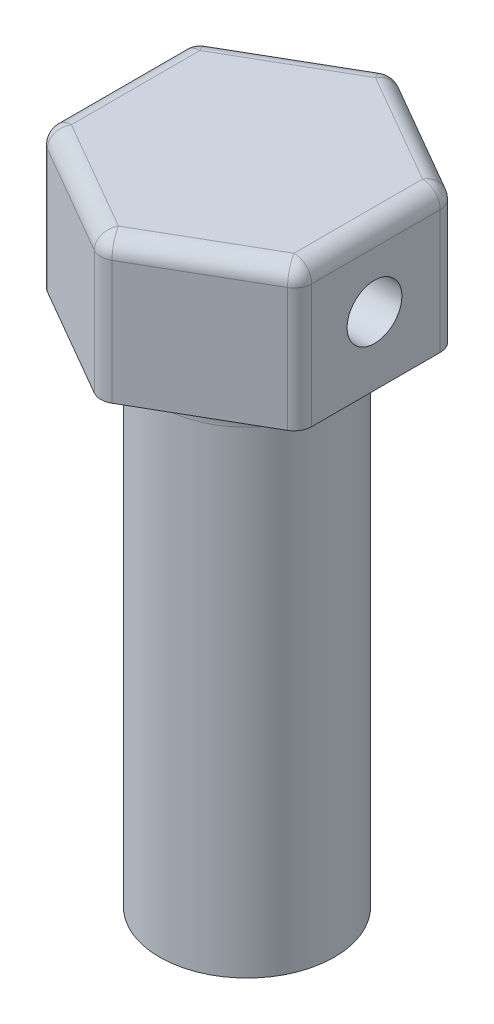
ISO-10303-21;
HEADER;
FILE_DESCRIPTION(('STEP AP214'),'2;1');
FILE_NAME('part.step','',(''),(''),'','','');
FILE_SCHEMA(('AUTOMOTIVE_DESIGN { 1 0 10303 214 1 1 1 1 }'));
ENDSEC;
DATA;
#1=APPLICATION_CONTEXT('core data for automotive mechanical design processes');
#2=APPLICATION_PROTOCOL_DEFINITION('international standard','automotive_design',2000,#1);
#3=PRODUCT_CONTEXT('',#1,'mechanical');
#4=PRODUCT('Part','Part','',(#3));
#5=PRODUCT_RELATED_PRODUCT_CATEGORY('part','',(#4));
#6=PRODUCT_DEFINITION_FORMATION('','',#4);
#7=PRODUCT_DEFINITION_CONTEXT('part definition',#1,'design');
#8=PRODUCT_DEFINITION('design','',#6,#7);
#9=PRODUCT_DEFINITION_SHAPE('','',#8);
#10=(LENGTH_UNIT() NAMED_UNIT(*) SI_UNIT(.MILLI.,.METRE.));
#11=(NAMED_UNIT(*) PLANE_ANGLE_UNIT() SI_UNIT($,.RADIAN.));
#12=(NAMED_UNIT(*) SI_UNIT($,.STERADIAN.) SOLID_ANGLE_UNIT());
#13=UNCERTAINTY_MEASURE_WITH_UNIT(LENGTH_MEASURE(1.E-05),#10,'distance_accuracy_value','');
#14=(GEOMETRIC_REPRESENTATION_CONTEXT(3) GLOBAL_UNCERTAINTY_ASSIGNED_CONTEXT((#13)) GLOBAL_UNIT_ASSIGNED_CONTEXT((#10,
#11,#12)) REPRESENTATION_CONTEXT('',''));
#15=CARTESIAN_POINT('',(0.,0.,0.));
#16=DIRECTION('',(0.,0.,1.));
#17=DIRECTION('',(1.,0.,0.));
#18=AXIS2_PLACEMENT_3D('',#15,#16,#17);
#19=CARTESIAN_POINT('',(-1.5,-29.,1.45177692845699));
#20=DIRECTION('',(1.,0.,0.));
#21=DIRECTION('',(0.,0.,-1.));
#22=AXIS2_PLACEMENT_3D('',#19,#20,#21);
#23=PLANE('',#22);
#24=DIRECTION('',(0.,1.,0.));
#25=VECTOR('',#24,1.);
#26=CARTESIAN_POINT('',(-1.5,-29.,1.45177692845699));
#27=LINE('',#26,#25);
#28=CARTESIAN_POINT('',(-1.5,-27.,1.45177692845699));
#29=VERTEX_POINT('',#28);
#30=CARTESIAN_POINT('',(-1.5,0.,1.45177692845699));
#31=VERTEX_POINT('',#30);
#32=EDGE_CURVE('E167',#29,#31,#27,.T.);
#33=ORIENTED_EDGE('',*,*,#32,.F.);
#34=DIRECTION('',(0.,0.,-1.));
#35=VECTOR('',#34,1.);
#36=CARTESIAN_POINT('',(-1.5,-27.,1.45177692845699));
#37=LINE('',#36,#35);
#38=CARTESIAN_POINT('',(-1.5,-27.,-1.45177692845699));
#39=VERTEX_POINT('',#38);
#40=EDGE_CURVE('E12',#29,#39,#37,.T.);
#41=ORIENTED_EDGE('',*,*,#40,.T.);
#42=DIRECTION('',(0.,1.,0.));
#43=VECTOR('',#42,1.);
#44=CARTESIAN_POINT('',(-1.5,-29.,-1.45177692845699));
#45=LINE('',#44,#43);
#46=CARTESIAN_POINT('',(-1.5,0.,-1.45177692845699));
#47=VERTEX_POINT('',#46);
#48=EDGE_CURVE('E169',#39,#47,#45,.T.);
#49=ORIENTED_EDGE('',*,*,#48,.T.);
#50=DIRECTION('',(0.,0.,-1.));
#51=VECTOR('',#50,1.);
#52=CARTESIAN_POINT('',(-1.5,0.,1.45177692845699));
#53=LINE('',#52,#51);
#54=EDGE_CURVE('E173',#31,#47,#53,.T.);
#55=ORIENTED_EDGE('',*,*,#54,.F.);
#56=EDGE_LOOP('',(#33,#41,#49,#55));
#57=FACE_BOUND('',#56,.T.);
#58=ADVANCED_FACE('F43',(#57),#23,.T.);
#59=CARTESIAN_POINT('',(0.,0.,0.));
#60=DIRECTION('',(0.,1.,0.));
#61=DIRECTION('',(0.,0.,1.));
#62=AXIS2_PLACEMENT_3D('',#59,#60,#61);
#63=PLANE('',#62);
#64=CARTESIAN_POINT('',(0.,0.,0.));
#65=DIRECTION('',(0.,1.,0.));
#66=DIRECTION('',(0.,0.,1.));
#67=AXIS2_PLACEMENT_3D('',#64,#65,#66);
#68=CIRCLE('',#67,6.95);
#69=CARTESIAN_POINT('',(0.,0.,6.95));
#70=VERTEX_POINT('',#69);
#71=EDGE_CURVE('E203',#70,#70,#68,.T.);
#72=ORIENTED_EDGE('',*,*,#71,.T.);
#73=EDGE_LOOP('',(#72));
#74=FACE_BOUND('',#73,.T.);
#75=DIRECTION('',(0.,0.,1.));
#76=VECTOR('',#75,1.);
#77=CARTESIAN_POINT('',(-7.3,0.,-4.21465696508427));
#78=LINE('',#77,#76);
#79=CARTESIAN_POINT('',(-7.3,0.,-3.63730669589464));
#80=VERTEX_POINT('',#79);
#81=CARTESIAN_POINT('',(-7.3,0.,3.63730669589464));
#82=VERTEX_POINT('',#81);
#83=EDGE_CURVE('E194',#80,#82,#78,.T.);
#84=ORIENTED_EDGE('',*,*,#83,.F.);
#85=CARTESIAN_POINT('',(-6.3,0.,-3.63730669589464));
#86=DIRECTION('',(0.,1.,0.));
#87=DIRECTION('',(0.,0.,1.));
#88=AXIS2_PLACEMENT_3D('',#85,#86,#87);
#89=CIRCLE('',#88,1.);
#90=CARTESIAN_POINT('',(-6.8,0.,-4.50333209967908));
#91=VERTEX_POINT('',#90);
#92=EDGE_CURVE('E51',#80,#91,#89,.F.);
#93=ORIENTED_EDGE('',*,*,#92,.T.);
#94=DIRECTION('',(-0.866025403784439,0.,0.5));
#95=VECTOR('',#94,1.);
#96=CARTESIAN_POINT('',(0.,0.,-8.42931393016854));
#97=LINE('',#96,#95);
#98=CARTESIAN_POINT('',(-0.5,0.,-8.14063879557373));
#99=VERTEX_POINT('',#98);
#100=EDGE_CURVE('E191',#99,#91,#97,.T.);
#101=ORIENTED_EDGE('',*,*,#100,.F.);
#102=CARTESIAN_POINT('',(0.,0.,-7.27461339178929));
#103=DIRECTION('',(0.,1.,0.));
#104=DIRECTION('',(0.,0.,1.));
#105=AXIS2_PLACEMENT_3D('',#102,#103,#104);
#106=CIRCLE('',#105,1.);
#107=CARTESIAN_POINT('',(0.5,0.,-8.14063879557372));
#108=VERTEX_POINT('',#107);
#109=EDGE_CURVE('E263',#99,#108,#106,.F.);
#110=ORIENTED_EDGE('',*,*,#109,.T.);
#111=DIRECTION('',(-0.866025403784439,0.,-0.5));
#112=VECTOR('',#111,1.);
#113=CARTESIAN_POINT('',(7.3,0.,-4.21465696508427));
#114=LINE('',#113,#112);
#115=CARTESIAN_POINT('',(6.8,0.,-4.50333209967908));
#116=VERTEX_POINT('',#115);
#117=EDGE_CURVE('E188',#116,#108,#114,.T.);
#118=ORIENTED_EDGE('',*,*,#117,.F.);
#119=CARTESIAN_POINT('',(6.3,0.,-3.63730669589465));
#120=DIRECTION('',(0.,1.,0.));
#121=DIRECTION('',(0.,0.,1.));
#122=AXIS2_PLACEMENT_3D('',#119,#120,#121);
#123=CIRCLE('',#122,1.);
#124=CARTESIAN_POINT('',(7.3,0.,-3.63730669589465));
#125=VERTEX_POINT('',#124);
#126=EDGE_CURVE('E261',#116,#125,#123,.F.);
#127=ORIENTED_EDGE('',*,*,#126,.T.);
#128=DIRECTION('',(0.,0.,-1.));
#129=VECTOR('',#128,1.);
#130=CARTESIAN_POINT('',(7.3,0.,4.21465696508427));
#131=LINE('',#130,#129);
#132=CARTESIAN_POINT('',(7.3,0.,3.63730669589464));
#133=VERTEX_POINT('',#132);
#134=EDGE_CURVE('E185',#133,#125,#131,.T.);
#135=ORIENTED_EDGE('',*,*,#134,.F.);
#136=CARTESIAN_POINT('',(6.3,0.,3.63730669589464));
#137=DIRECTION('',(0.,1.,0.));
#138=DIRECTION('',(0.,0.,1.));
#139=AXIS2_PLACEMENT_3D('',#136,#137,#138);
#140=CIRCLE('',#139,1.);
#141=CARTESIAN_POINT('',(6.8,0.,4.50333209967908));
#142=VERTEX_POINT('',#141);
#143=EDGE_CURVE('E259',#133,#142,#140,.F.);
#144=ORIENTED_EDGE('',*,*,#143,.T.);
#145=DIRECTION('',(0.866025403784439,0.,-0.5));
#146=VECTOR('',#145,1.);
#147=CARTESIAN_POINT('',(0.,0.,8.42931393016854));
#148=LINE('',#147,#146);
#149=CARTESIAN_POINT('',(0.500000000000001,0.,8.14063879557373));
#150=VERTEX_POINT('',#149);
#151=EDGE_CURVE('E178',#150,#142,#148,.T.);
#152=ORIENTED_EDGE('',*,*,#151,.F.);
#153=CARTESIAN_POINT('',(0.,0.,7.27461339178929));
#154=DIRECTION('',(0.,1.,0.));
#155=DIRECTION('',(0.,0.,1.));
#156=AXIS2_PLACEMENT_3D('',#153,#154,#155);
#157=CIRCLE('',#156,1.);
#158=CARTESIAN_POINT('',(-0.5,0.,8.14063879557373));
#159=VERTEX_POINT('',#158);
#160=EDGE_CURVE('E257',#150,#159,#157,.F.);
#161=ORIENTED_EDGE('',*,*,#160,.T.);
#162=DIRECTION('',(0.866025403784438,0.,0.5));
#163=VECTOR('',#162,1.);
#164=CARTESIAN_POINT('',(-7.3,0.,4.21465696508427));
#165=LINE('',#164,#163);
#166=CARTESIAN_POINT('',(-6.8,0.,4.50333209967908));
#167=VERTEX_POINT('',#166);
#168=EDGE_CURVE('E197',#167,#159,#165,.T.);
#169=ORIENTED_EDGE('',*,*,#168,.F.);
#170=CARTESIAN_POINT('',(-6.3,0.,3.63730669589464));
#171=DIRECTION('',(0.,1.,0.));
#172=DIRECTION('',(0.,0.,1.));
#173=AXIS2_PLACEMENT_3D('',#170,#171,#172);
#174=CIRCLE('',#173,1.);
#175=EDGE_CURVE('E255',#167,#82,#174,.F.);
#176=ORIENTED_EDGE('',*,*,#175,.T.);
#177=EDGE_LOOP('',(#84,#93,#101,#110,#118,#127,#135,#144,#152,#161,#169,#176));
#178=FACE_BOUND('',#177,.T.);
#179=ADVANCED_FACE('F335',(#74,#178),#63,.F.);
#180=CARTESIAN_POINT('',(0.,8.,8.42931393016854));
#181=DIRECTION('',(-0.5,0.,-0.866025403784439));
#182=DIRECTION('',(-0.866025403784439,0.,0.5));
#183=AXIS2_PLACEMENT_3D('',#180,#181,#182);
#184=PLANE('',#183);
#185=ORIENTED_EDGE('',*,*,#151,.T.);
#186=DIRECTION('',(0.,-1.,0.));
#187=VECTOR('',#186,1.);
#188=CARTESIAN_POINT('',(6.8,8.,4.50333209967908));
#189=LINE('',#188,#187);
#190=CARTESIAN_POINT('',(6.8,7.,4.50333209967908));
#191=VERTEX_POINT('',#190);
#192=EDGE_CURVE('E64',#142,#191,#189,.F.);
#193=ORIENTED_EDGE('',*,*,#192,.T.);
#194=DIRECTION('',(0.866025403784439,0.,-0.5));
#195=VECTOR('',#194,1.);
#196=CARTESIAN_POINT('',(0.,7.,8.42931393016854));
#197=LINE('',#196,#195);
#198=CARTESIAN_POINT('',(0.5,7.,8.14063879557373));
#199=VERTEX_POINT('',#198);
#200=EDGE_CURVE('E252',#191,#199,#197,.F.);
#201=ORIENTED_EDGE('',*,*,#200,.T.);
#202=DIRECTION('',(0.,-1.,0.));
#203=VECTOR('',#202,1.);
#204=CARTESIAN_POINT('',(0.5,8.,8.14063879557373));
#205=LINE('',#204,#203);
#206=EDGE_CURVE('E250',#199,#150,#205,.T.);
#207=ORIENTED_EDGE('',*,*,#206,.T.);
#208=EDGE_LOOP('',(#185,#193,#201,#207));
#209=FACE_BOUND('',#208,.T.);
#210=ADVANCED_FACE('F348',(#209),#184,.F.);
#211=CARTESIAN_POINT('',(7.3,8.,4.21465696508427));
#212=DIRECTION('',(-1.,0.,0.));
#213=DIRECTION('',(0.,0.,1.));
#214=AXIS2_PLACEMENT_3D('',#211,#212,#213);
#215=PLANE('',#214);
#216=CARTESIAN_POINT('',(7.3,3.85,0.0853430349157284));
#217=DIRECTION('',(1.,0.,0.));
#218=DIRECTION('',(0.,0.,-1.));
#219=AXIS2_PLACEMENT_3D('',#216,#217,#218);
#220=CIRCLE('',#219,1.55);
#221=CARTESIAN_POINT('',(7.3,3.85,-1.46465696508427));
#222=VERTEX_POINT('',#221);
#223=EDGE_CURVE('E315',#222,#222,#220,.T.);
#224=ORIENTED_EDGE('',*,*,#223,.F.);
#225=EDGE_LOOP('',(#224));
#226=FACE_BOUND('',#225,.T.);
#227=ORIENTED_EDGE('',*,*,#134,.T.);
#228=DIRECTION('',(0.,-1.,0.));
#229=VECTOR('',#228,1.);
#230=CARTESIAN_POINT('',(7.3,8.,-3.63730669589465));
#231=LINE('',#230,#229);
#232=CARTESIAN_POINT('',(7.3,7.,-3.63730669589465));
#233=VERTEX_POINT('',#232);
#234=EDGE_CURVE('E248',#125,#233,#231,.F.);
#235=ORIENTED_EDGE('',*,*,#234,.T.);
#236=DIRECTION('',(0.,0.,-1.));
#237=VECTOR('',#236,1.);
#238=CARTESIAN_POINT('',(7.3,7.,4.21465696508427));
#239=LINE('',#238,#237);
#240=CARTESIAN_POINT('',(7.3,7.,3.63730669589464));
#241=VERTEX_POINT('',#240);
#242=EDGE_CURVE('E246',#233,#241,#239,.F.);
#243=ORIENTED_EDGE('',*,*,#242,.T.);
#244=DIRECTION('',(0.,-1.,0.));
#245=VECTOR('',#244,1.);
#246=CARTESIAN_POINT('',(7.3,8.,3.63730669589464));
#247=LINE('',#246,#245);
#248=EDGE_CURVE('E244',#241,#133,#247,.T.);
#249=ORIENTED_EDGE('',*,*,#248,.T.);
#250=EDGE_LOOP('',(#227,#235,#243,#249));
#251=FACE_BOUND('',#250,.T.);
#252=ADVANCED_FACE('F413',(#226,#251),#215,.F.);
#253=CARTESIAN_POINT('',(7.3,8.,-4.21465696508427));
#254=DIRECTION('',(-0.5,0.,0.866025403784439));
#255=DIRECTION('',(0.866025403784439,0.,0.5));
#256=AXIS2_PLACEMENT_3D('',#253,#254,#255);
#257=PLANE('',#256);
#258=ORIENTED_EDGE('',*,*,#117,.T.);
#259=DIRECTION('',(0.,-1.,0.));
#260=VECTOR('',#259,1.);
#261=CARTESIAN_POINT('',(0.5,8.,-8.14063879557372));
#262=LINE('',#261,#260);
#263=CARTESIAN_POINT('',(0.499999999999999,7.,-8.14063879557372));
#264=VERTEX_POINT('',#263);
#265=EDGE_CURVE('E242',#108,#264,#262,.F.);
#266=ORIENTED_EDGE('',*,*,#265,.T.);
#267=DIRECTION('',(-0.866025403784439,0.,-0.5));
#268=VECTOR('',#267,1.);
#269=CARTESIAN_POINT('',(7.3,7.,-4.21465696508427));
#270=LINE('',#269,#268);
#271=CARTESIAN_POINT('',(6.8,7.,-4.50333209967908));
#272=VERTEX_POINT('',#271);
#273=EDGE_CURVE('E240',#264,#272,#270,.F.);
#274=ORIENTED_EDGE('',*,*,#273,.T.);
#275=DIRECTION('',(0.,-1.,0.));
#276=VECTOR('',#275,1.);
#277=CARTESIAN_POINT('',(6.8,8.,-4.50333209967908));
#278=LINE('',#277,#276);
#279=EDGE_CURVE('E238',#272,#116,#278,.T.);
#280=ORIENTED_EDGE('',*,*,#279,.T.);
#281=EDGE_LOOP('',(#258,#266,#274,#280));
#282=FACE_BOUND('',#281,.T.);
#283=ADVANCED_FACE('F461',(#282),#257,.F.);
#284=CARTESIAN_POINT('',(0.,8.,-8.42931393016854));
#285=DIRECTION('',(0.5,0.,0.866025403784439));
#286=DIRECTION('',(0.866025403784439,0.,-0.5));
#287=AXIS2_PLACEMENT_3D('',#284,#285,#286);
#288=PLANE('',#287);
#289=ORIENTED_EDGE('',*,*,#100,.T.);
#290=DIRECTION('',(0.,-1.,0.));
#291=VECTOR('',#290,1.);
#292=CARTESIAN_POINT('',(-6.8,8.,-4.50333209967908));
#293=LINE('',#292,#291);
#294=CARTESIAN_POINT('',(-6.8,7.,-4.50333209967908));
#295=VERTEX_POINT('',#294);
#296=EDGE_CURVE('E236',#91,#295,#293,.F.);
#297=ORIENTED_EDGE('',*,*,#296,.T.);
#298=DIRECTION('',(-0.866025403784439,0.,0.5));
#299=VECTOR('',#298,1.);
#300=CARTESIAN_POINT('',(0.,7.,-8.42931393016854));
#301=LINE('',#300,#299);
#302=CARTESIAN_POINT('',(-0.500000000000001,7.,-8.14063879557373));
#303=VERTEX_POINT('',#302);
#304=EDGE_CURVE('E234',#295,#303,#301,.F.);
#305=ORIENTED_EDGE('',*,*,#304,.T.);
#306=DIRECTION('',(0.,-1.,0.));
#307=VECTOR('',#306,1.);
#308=CARTESIAN_POINT('',(-0.500000000000001,8.,-8.14063879557373));
#309=LINE('',#308,#307);
#310=EDGE_CURVE('E232',#303,#99,#309,.T.);
#311=ORIENTED_EDGE('',*,*,#310,.T.);
#312=EDGE_LOOP('',(#289,#297,#305,#311));
#313=FACE_BOUND('',#312,.T.);
#314=ADVANCED_FACE('F511',(#313),#288,.F.);
#315=CARTESIAN_POINT('',(-7.3,8.,-4.21465696508427));
#316=DIRECTION('',(1.,0.,0.));
#317=DIRECTION('',(0.,0.,-1.));
#318=AXIS2_PLACEMENT_3D('',#315,#316,#317);
#319=PLANE('',#318);
#320=CARTESIAN_POINT('',(-7.3,3.85,0.0853430349157314));
#321=DIRECTION('',(1.,0.,0.));
#322=DIRECTION('',(0.,0.,-1.));
#323=AXIS2_PLACEMENT_3D('',#320,#321,#322);
#324=CIRCLE('',#323,1.55);
#325=CARTESIAN_POINT('',(-7.3,3.85,-1.46465696508427));
#326=VERTEX_POINT('',#325);
#327=EDGE_CURVE('E320',#326,#326,#324,.T.);
#328=ORIENTED_EDGE('',*,*,#327,.T.);
#329=EDGE_LOOP('',(#328));
#330=FACE_BOUND('',#329,.T.);
#331=DIRECTION('',(0.,0.,1.));
#332=VECTOR('',#331,1.);
#333=CARTESIAN_POINT('',(-7.3,7.,-4.21465696508427));
#334=LINE('',#333,#332);
#335=CARTESIAN_POINT('',(-7.3,7.,3.63730669589464));
#336=VERTEX_POINT('',#335);
#337=CARTESIAN_POINT('',(-7.3,7.,-3.63730669589464));
#338=VERTEX_POINT('',#337);
#339=EDGE_CURVE('E228',#336,#338,#334,.F.);
#340=ORIENTED_EDGE('',*,*,#339,.T.);
#341=DIRECTION('',(0.,-1.,0.));
#342=VECTOR('',#341,1.);
#343=CARTESIAN_POINT('',(-7.3,8.,-3.63730669589464));
#344=LINE('',#343,#342);
#345=EDGE_CURVE('E230',#338,#80,#344,.T.);
#346=ORIENTED_EDGE('',*,*,#345,.T.);
#347=ORIENTED_EDGE('',*,*,#83,.T.);
#348=DIRECTION('',(0.,-1.,0.));
#349=VECTOR('',#348,1.);
#350=CARTESIAN_POINT('',(-7.3,8.,3.63730669589464));
#351=LINE('',#350,#349);
#352=EDGE_CURVE('E226',#82,#336,#351,.F.);
#353=ORIENTED_EDGE('',*,*,#352,.T.);
#354=EDGE_LOOP('',(#340,#346,#347,#353));
#355=FACE_BOUND('',#354,.T.);
#356=ADVANCED_FACE('F370',(#330,#355),#319,.F.);
#357=CARTESIAN_POINT('',(-7.3,8.,4.21465696508427));
#358=DIRECTION('',(0.5,0.,-0.866025403784439));
#359=DIRECTION('',(-0.866025403784438,0.,-0.5));
#360=AXIS2_PLACEMENT_3D('',#357,#358,#359);
#361=PLANE('',#360);
#362=ORIENTED_EDGE('',*,*,#168,.T.);
#363=DIRECTION('',(0.,-1.,0.));
#364=VECTOR('',#363,1.);
#365=CARTESIAN_POINT('',(-0.5,8.,8.14063879557373));
#366=LINE('',#365,#364);
#367=CARTESIAN_POINT('',(-0.5,7.,8.14063879557373));
#368=VERTEX_POINT('',#367);
#369=EDGE_CURVE('E224',#159,#368,#366,.F.);
#370=ORIENTED_EDGE('',*,*,#369,.T.);
#371=DIRECTION('',(0.866025403784438,0.,0.5));
#372=VECTOR('',#371,1.);
#373=CARTESIAN_POINT('',(-7.3,7.,4.21465696508427));
#374=LINE('',#373,#372);
#375=CARTESIAN_POINT('',(-6.8,7.,4.50333209967908));
#376=VERTEX_POINT('',#375);
#377=EDGE_CURVE('E221',#368,#376,#374,.F.);
#378=ORIENTED_EDGE('',*,*,#377,.T.);
#379=DIRECTION('',(0.,-1.,0.));
#380=VECTOR('',#379,1.);
#381=CARTESIAN_POINT('',(-6.8,8.,4.50333209967908));
#382=LINE('',#381,#380);
#383=EDGE_CURVE('E219',#376,#167,#382,.T.);
#384=ORIENTED_EDGE('',*,*,#383,.T.);
#385=EDGE_LOOP('',(#362,#370,#378,#384));
#386=FACE_BOUND('',#385,.T.);
#387=ADVANCED_FACE('F365',(#386),#361,.F.);
#388=CARTESIAN_POINT('',(0.,8.,0.));
#389=DIRECTION('',(0.,1.,0.));
#390=DIRECTION('',(0.,0.,1.));
#391=AXIS2_PLACEMENT_3D('',#388,#389,#390);
#392=PLANE('',#391);
#393=DIRECTION('',(0.,0.,1.));
#394=VECTOR('',#393,1.);
#395=CARTESIAN_POINT('',(-6.3,8.,4.21465696508427));
#396=LINE('',#395,#394);
#397=CARTESIAN_POINT('',(-6.3,8.,-3.63730669589464));
#398=VERTEX_POINT('',#397);
#399=CARTESIAN_POINT('',(-6.3,8.,3.63730669589464));
#400=VERTEX_POINT('',#399);
#401=EDGE_CURVE('E214',#398,#400,#396,.T.);
#402=ORIENTED_EDGE('',*,*,#401,.T.);
#403=DIRECTION('',(0.866025403784438,0.,0.5));
#404=VECTOR('',#403,1.);
#405=CARTESIAN_POINT('',(0.499999999999999,8.,7.5632885263841));
#406=LINE('',#405,#404);
#407=CARTESIAN_POINT('',(0.,8.,7.27461339178929));
#408=VERTEX_POINT('',#407);
#409=EDGE_CURVE('E216',#400,#408,#406,.T.);
#410=ORIENTED_EDGE('',*,*,#409,.T.);
#411=DIRECTION('',(0.866025403784439,0.,-0.5));
#412=VECTOR('',#411,1.);
#413=CARTESIAN_POINT('',(6.8,8.,3.34863156129983));
#414=LINE('',#413,#412);
#415=CARTESIAN_POINT('',(6.3,8.,3.63730669589465));
#416=VERTEX_POINT('',#415);
#417=EDGE_CURVE('E206',#408,#416,#414,.T.);
#418=ORIENTED_EDGE('',*,*,#417,.T.);
#419=DIRECTION('',(0.,0.,-1.));
#420=VECTOR('',#419,1.);
#421=CARTESIAN_POINT('',(6.3,8.,-4.21465696508427));
#422=LINE('',#421,#420);
#423=CARTESIAN_POINT('',(6.3,8.,-3.63730669589465));
#424=VERTEX_POINT('',#423);
#425=EDGE_CURVE('E208',#416,#424,#422,.T.);
#426=ORIENTED_EDGE('',*,*,#425,.T.);
#427=DIRECTION('',(-0.866025403784439,0.,-0.5));
#428=VECTOR('',#427,1.);
#429=CARTESIAN_POINT('',(-0.500000000000001,8.,-7.5632885263841));
#430=LINE('',#429,#428);
#431=CARTESIAN_POINT('',(0.,8.,-7.27461339178929));
#432=VERTEX_POINT('',#431);
#433=EDGE_CURVE('E210',#424,#432,#430,.T.);
#434=ORIENTED_EDGE('',*,*,#433,.T.);
#435=DIRECTION('',(-0.866025403784439,0.,0.5));
#436=VECTOR('',#435,1.);
#437=CARTESIAN_POINT('',(-6.8,8.,-3.34863156129983));
#438=LINE('',#437,#436);
#439=EDGE_CURVE('E212',#432,#398,#438,.T.);
#440=ORIENTED_EDGE('',*,*,#439,.T.);
#441=EDGE_LOOP('',(#402,#410,#418,#426,#434,#440));
#442=FACE_BOUND('',#441,.T.);
#443=ADVANCED_FACE('F360',(#442),#392,.T.);
#444=CARTESIAN_POINT('',(0.,-29.,0.));
#445=DIRECTION('',(0.,-1.,0.));
#446=DIRECTION('',(0.,0.,-1.));
#447=AXIS2_PLACEMENT_3D('',#444,#445,#446);
#448=PLANE('',#447);
#449=CARTESIAN_POINT('',(0.,-29.,0.));
#450=DIRECTION('',(0.,-1.,0.));
#451=DIRECTION('',(0.,0.,-1.));
#452=AXIS2_PLACEMENT_3D('',#449,#450,#451);
#453=CIRCLE('',#452,2.0875);
#454=CARTESIAN_POINT('',(0.,-29.,-2.0875));
#455=VERTEX_POINT('',#454);
#456=EDGE_CURVE('E180',#455,#455,#453,.T.);
#457=ORIENTED_EDGE('',*,*,#456,.F.);
#458=EDGE_LOOP('',(#457));
#459=FACE_BOUND('',#458,.T.);
#460=CARTESIAN_POINT('',(0.,-29.,0.));
#461=DIRECTION('',(0.,-1.,0.));
#462=DIRECTION('',(0.,0.,-1.));
#463=AXIS2_PLACEMENT_3D('',#460,#461,#462);
#464=CIRCLE('',#463,4.95);
#465=CARTESIAN_POINT('',(0.,-29.,4.95));
#466=VERTEX_POINT('',#465);
#467=EDGE_CURVE('E175',#466,#466,#464,.T.);
#468=ORIENTED_EDGE('',*,*,#467,.T.);
#469=EDGE_LOOP('',(#468));
#470=FACE_BOUND('',#469,.T.);
#471=ADVANCED_FACE('F357',(#459,#470),#448,.T.);
#472=CARTESIAN_POINT('',(0.,-29.,0.));
#473=DIRECTION('',(0.,1.,0.));
#474=DIRECTION('',(0.,0.,1.));
#475=AXIS2_PLACEMENT_3D('',#472,#473,#474);
#476=CYLINDRICAL_SURFACE('',#475,4.95);
#477=CARTESIAN_POINT('',(0.,-2.,0.));
#478=DIRECTION('',(0.,1.,0.));
#479=DIRECTION('',(0.,0.,1.));
#480=AXIS2_PLACEMENT_3D('',#477,#478,#479);
#481=CIRCLE('',#480,4.95);
#482=CARTESIAN_POINT('',(0.,-2.,4.95));
#483=VERTEX_POINT('',#482);
#484=EDGE_CURVE('E200',#483,#483,#481,.F.);
#485=CARTESIAN_POINT('',(0.,-2.,4.95));
#486=CARTESIAN_POINT('',(0.,-2.28125,4.95));
#487=CARTESIAN_POINT('',(0.,-2.5625,4.95));
#488=CARTESIAN_POINT('',(0.,-3.125,4.95));
#489=CARTESIAN_POINT('',(0.,-3.40625,4.95));
#490=CARTESIAN_POINT('',(0.,-3.96875,4.95));
#491=CARTESIAN_POINT('',(0.,-4.25,4.95));
#492=CARTESIAN_POINT('',(0.,-4.8125,4.95));
#493=CARTESIAN_POINT('',(0.,-5.09375,4.95));
#494=CARTESIAN_POINT('',(0.,-5.65625,4.95));
#495=CARTESIAN_POINT('',(0.,-5.9375,4.95));
#496=CARTESIAN_POINT('',(0.,-6.5,4.95));
#497=CARTESIAN_POINT('',(0.,-6.78125,4.95));
#498=CARTESIAN_POINT('',(0.,-7.34375,4.95));
#499=CARTESIAN_POINT('',(0.,-7.625,4.95));
#500=CARTESIAN_POINT('',(0.,-8.1875,4.95));
#501=CARTESIAN_POINT('',(0.,-8.46875,4.95));
#502=CARTESIAN_POINT('',(0.,-9.03125,4.95));
#503=CARTESIAN_POINT('',(0.,-9.3125,4.95));
#504=CARTESIAN_POINT('',(0.,-9.875,4.95));
#505=CARTESIAN_POINT('',(0.,-10.15625,4.95));
#506=CARTESIAN_POINT('',(0.,-10.71875,4.95));
#507=CARTESIAN_POINT('',(0.,-11.,4.95));
#508=CARTESIAN_POINT('',(0.,-11.5625,4.95));
#509=CARTESIAN_POINT('',(0.,-11.84375,4.95));
#510=CARTESIAN_POINT('',(0.,-12.40625,4.95));
#511=CARTESIAN_POINT('',(0.,-12.6875,4.95));
#512=CARTESIAN_POINT('',(0.,-13.25,4.95));
#513=CARTESIAN_POINT('',(0.,-13.53125,4.95));
#514=CARTESIAN_POINT('',(0.,-14.09375,4.95));
#515=CARTESIAN_POINT('',(0.,-14.375,4.95));
#516=CARTESIAN_POINT('',(0.,-14.9375,4.95));
#517=CARTESIAN_POINT('',(0.,-15.21875,4.95));
#518=CARTESIAN_POINT('',(0.,-15.78125,4.95));
#519=CARTESIAN_POINT('',(0.,-16.0625,4.95));
#520=CARTESIAN_POINT('',(0.,-16.625,4.95));
#521=CARTESIAN_POINT('',(0.,-16.90625,4.95));
#522=CARTESIAN_POINT('',(0.,-17.46875,4.95));
#523=CARTESIAN_POINT('',(0.,-17.75,4.95));
#524=CARTESIAN_POINT('',(0.,-18.3125,4.95));
#525=CARTESIAN_POINT('',(0.,-18.59375,4.95));
#526=CARTESIAN_POINT('',(0.,-19.15625,4.95));
#527=CARTESIAN_POINT('',(0.,-19.4375,4.95));
#528=CARTESIAN_POINT('',(0.,-20.,4.95));
#529=CARTESIAN_POINT('',(0.,-20.28125,4.95));
#530=CARTESIAN_POINT('',(0.,-20.84375,4.95));
#531=CARTESIAN_POINT('',(0.,-21.125,4.95));
#532=CARTESIAN_POINT('',(0.,-21.6875,4.95));
#533=CARTESIAN_POINT('',(0.,-21.96875,4.95));
#534=CARTESIAN_POINT('',(0.,-22.53125,4.95));
#535=CARTESIAN_POINT('',(0.,-22.8125,4.95));
#536=CARTESIAN_POINT('',(0.,-23.375,4.95));
#537=CARTESIAN_POINT('',(0.,-23.65625,4.95));
#538=CARTESIAN_POINT('',(0.,-24.21875,4.95));
#539=CARTESIAN_POINT('',(0.,-24.5,4.95));
#540=CARTESIAN_POINT('',(0.,-25.0625,4.95));
#541=CARTESIAN_POINT('',(0.,-25.34375,4.95));
#542=CARTESIAN_POINT('',(0.,-25.90625,4.95));
#543=CARTESIAN_POINT('',(0.,-26.1875,4.95));
#544=CARTESIAN_POINT('',(0.,-26.75,4.95));
#545=CARTESIAN_POINT('',(0.,-27.03125,4.95));
#546=CARTESIAN_POINT('',(0.,-27.59375,4.95));
#547=CARTESIAN_POINT('',(0.,-27.875,4.95));
#548=CARTESIAN_POINT('',(0.,-28.4375,4.95));
#549=CARTESIAN_POINT('',(0.,-28.71875,4.95));
#550=CARTESIAN_POINT('',(0.,-29.,4.95));
#551=B_SPLINE_CURVE_WITH_KNOTS('',3,(#485,#486,#487,#488,#489,#490,#491,#492,#493,#494,#495,
#496,#497,#498,#499,#500,#501,#502,#503,#504,#505,#506,#507,#508,#509,#510,#511,#512,#513,#514,
#515,#516,#517,#518,#519,#520,#521,#522,#523,#524,#525,#526,#527,#528,#529,#530,#531,#532,#533,
#534,#535,#536,#537,#538,#539,#540,#541,#542,#543,#544,#545,#546,#547,#548,#549,#550),
.UNSPECIFIED.,.F.,.F.,(4,2,2,2,2,2,2,2,2,2,2,2,2,2,2,2,2,2,2,2,2,2,2,2,2,2,2,2,2,2,2,2,4),(0.,
0.843750000000001,1.6875,2.53125,3.375,4.21875,5.0625,5.90625,6.75,7.59375,8.4375,9.28125,
10.125,10.96875,11.8125,12.65625,13.5,14.34375,15.1875,16.03125,16.875,17.71875,18.5625,
19.40625,20.25,21.09375,21.9375,22.78125,23.625,24.46875,25.3125,26.15625,27.),.UNSPECIFIED.);
#552=EDGE_CURVE('BSEAM343',#483,#466,#551,.T.);
#553=ORIENTED_EDGE('',*,*,#484,.T.);
#554=ORIENTED_EDGE('',*,*,#467,.F.);
#555=ORIENTED_EDGE('',*,*,#552,.T.);
#556=ORIENTED_EDGE('',*,*,#552,.F.);
#557=EDGE_LOOP('',(#553,#555,#554,#556));
#558=FACE_BOUND('',#557,.T.);
#559=ADVANCED_FACE('F343',(#558),#476,.T.);
#560=CARTESIAN_POINT('',(0.,-29.,0.));
#561=DIRECTION('',(0.,1.,0.));
#562=DIRECTION('',(0.,0.,1.));
#563=AXIS2_PLACEMENT_3D('',#560,#561,#562);
#564=CYLINDRICAL_SURFACE('',#563,2.0875);
#565=CARTESIAN_POINT('',(0.,-27.,0.));
#566=DIRECTION('',(0.,-1.,0.));
#567=DIRECTION('',(0.,0.,-1.));
#568=AXIS2_PLACEMENT_3D('',#565,#566,#567);
#569=CIRCLE('',#568,2.0875);
#570=EDGE_CURVE('E57',#29,#39,#569,.T.);
#571=ORIENTED_EDGE('',*,*,#570,.F.);
#572=ORIENTED_EDGE('',*,*,#32,.T.);
#573=CARTESIAN_POINT('',(0.,0.,0.));
#574=DIRECTION('',(0.,-1.,0.));
#575=DIRECTION('',(0.,0.,-1.));
#576=AXIS2_PLACEMENT_3D('',#573,#574,#575);
#577=CIRCLE('',#576,2.0875);
#578=EDGE_CURVE('E325',#47,#31,#577,.T.);
#579=ORIENTED_EDGE('',*,*,#578,.F.);
#580=ORIENTED_EDGE('',*,*,#48,.F.);
#581=EDGE_LOOP('',(#571,#572,#579,#580));
#582=FACE_BOUND('',#581,.T.);
#583=ORIENTED_EDGE('',*,*,#456,.T.);
#584=EDGE_LOOP('',(#583));
#585=FACE_BOUND('',#584,.T.);
#586=ADVANCED_FACE('F164',(#582,#585),#564,.F.);
#587=ORIENTED_EDGE('',*,*,#54,.T.);
#588=ORIENTED_EDGE('',*,*,#578,.T.);
#589=EDGE_LOOP('',(#587,#588));
#590=FACE_BOUND('',#589,.T.);
#591=ADVANCED_FACE('F331',(#590),#63,.F.);
#592=CARTESIAN_POINT('',(0.,-2.,0.));
#593=DIRECTION('',(0.,1.,0.));
#594=DIRECTION('',(0.,0.,1.));
#595=AXIS2_PLACEMENT_3D('',#592,#593,#594);
#596=TOROIDAL_SURFACE('',#595,6.95,2.);
#597=ORIENTED_EDGE('',*,*,#71,.F.);
#598=EDGE_LOOP('',(#597));
#599=FACE_BOUND('',#598,.T.);
#600=ORIENTED_EDGE('',*,*,#484,.F.);
#601=EDGE_LOOP('',(#600));
#602=FACE_BOUND('',#601,.T.);
#603=ADVANCED_FACE('F333',(#599,#602),#596,.F.);
#604=CARTESIAN_POINT('',(-7.3,3.85,0.0853430349157314));
#605=DIRECTION('',(1.,0.,0.));
#606=DIRECTION('',(0.,0.,-1.));
#607=AXIS2_PLACEMENT_3D('',#604,#605,#606);
#608=CYLINDRICAL_SURFACE('',#607,1.55);
#609=ORIENTED_EDGE('',*,*,#327,.F.);
#610=EDGE_LOOP('',(#609));
#611=FACE_BOUND('',#610,.T.);
#612=ORIENTED_EDGE('',*,*,#223,.T.);
#613=EDGE_LOOP('',(#612));
#614=FACE_BOUND('',#613,.T.);
#615=ADVANCED_FACE('F340',(#611,#614),#608,.F.);
#616=CARTESIAN_POINT('',(0.,8.,-7.27461339178929));
#617=DIRECTION('',(0.,-1.,0.));
#618=DIRECTION('',(0.,0.,-1.));
#619=AXIS2_PLACEMENT_3D('',#616,#617,#618);
#620=CYLINDRICAL_SURFACE('',#619,1.);
#621=ORIENTED_EDGE('',*,*,#109,.F.);
#622=ORIENTED_EDGE('',*,*,#310,.F.);
#623=CARTESIAN_POINT('',(0.,7.,-7.27461339178929));
#624=DIRECTION('',(0.,1.,0.));
#625=DIRECTION('',(0.,0.,1.));
#626=AXIS2_PLACEMENT_3D('',#623,#624,#625);
#627=CIRCLE('',#626,1.);
#628=EDGE_CURVE('E313',#264,#303,#627,.T.);
#629=ORIENTED_EDGE('',*,*,#628,.F.);
#630=ORIENTED_EDGE('',*,*,#265,.F.);
#631=EDGE_LOOP('',(#621,#622,#629,#630));
#632=FACE_BOUND('',#631,.T.);
#633=ADVANCED_FACE('F45',(#632),#620,.T.);
#634=CARTESIAN_POINT('',(3.15,7.,-5.45596004384197));
#635=DIRECTION('',(0.866025403784439,0.,0.5));
#636=DIRECTION('',(0.5,0.,-0.866025403784439));
#637=AXIS2_PLACEMENT_3D('',#634,#635,#636);
#638=CYLINDRICAL_SURFACE('',#637,1.);
#639=CARTESIAN_POINT('',(6.3,7.,-3.63730669589465));
#640=DIRECTION('',(0.866025403784439,0.,0.5));
#641=DIRECTION('',(0.5,0.,-0.866025403784439));
#642=AXIS2_PLACEMENT_3D('',#639,#640,#641);
#643=CIRCLE('',#642,1.);
#644=EDGE_CURVE('E308',#272,#424,#643,.T.);
#645=ORIENTED_EDGE('',*,*,#644,.F.);
#646=ORIENTED_EDGE('',*,*,#273,.F.);
#647=CARTESIAN_POINT('',(0.,7.,-7.27461339178929));
#648=DIRECTION('',(-0.866025403784438,0.,-0.5));
#649=DIRECTION('',(-0.5,0.,0.866025403784439));
#650=AXIS2_PLACEMENT_3D('',#647,#648,#649);
#651=CIRCLE('',#650,1.);
#652=EDGE_CURVE('E311',#432,#264,#651,.T.);
#653=ORIENTED_EDGE('',*,*,#652,.F.);
#654=ORIENTED_EDGE('',*,*,#433,.F.);
#655=EDGE_LOOP('',(#645,#646,#653,#654));
#656=FACE_BOUND('',#655,.T.);
#657=ADVANCED_FACE('F429',(#656),#638,.T.);
#658=CARTESIAN_POINT('',(6.3,8.,-3.63730669589465));
#659=DIRECTION('',(0.,-1.,0.));
#660=DIRECTION('',(0.,0.,-1.));
#661=AXIS2_PLACEMENT_3D('',#658,#659,#660);
#662=CYLINDRICAL_SURFACE('',#661,1.);
#663=ORIENTED_EDGE('',*,*,#126,.F.);
#664=ORIENTED_EDGE('',*,*,#279,.F.);
#665=CARTESIAN_POINT('',(6.3,7.,-3.63730669589465));
#666=DIRECTION('',(0.,1.,0.));
#667=DIRECTION('',(0.,0.,1.));
#668=AXIS2_PLACEMENT_3D('',#665,#666,#667);
#669=CIRCLE('',#668,1.);
#670=EDGE_CURVE('E305',#233,#272,#669,.T.);
#671=ORIENTED_EDGE('',*,*,#670,.F.);
#672=ORIENTED_EDGE('',*,*,#234,.F.);
#673=EDGE_LOOP('',(#663,#664,#671,#672));
#674=FACE_BOUND('',#673,.T.);
#675=ADVANCED_FACE('F422',(#674),#662,.T.);
#676=CARTESIAN_POINT('',(0.,7.,-7.27461339178929));
#677=DIRECTION('',(0.,1.,0.));
#678=DIRECTION('',(-1.,0.,0.));
#679=AXIS2_PLACEMENT_3D('',#676,#677,#678);
#680=SPHERICAL_SURFACE('',#679,1.);
#681=ORIENTED_EDGE('',*,*,#652,.T.);
#682=ORIENTED_EDGE('',*,*,#628,.T.);
#683=CARTESIAN_POINT('',(0.,7.,-7.27461339178929));
#684=DIRECTION('',(0.866025403784439,0.,-0.5));
#685=DIRECTION('',(-0.5,0.,-0.866025403784439));
#686=AXIS2_PLACEMENT_3D('',#683,#684,#685);
#687=CIRCLE('',#686,1.);
#688=EDGE_CURVE('E302',#432,#303,#687,.F.);
#689=ORIENTED_EDGE('',*,*,#688,.F.);
#690=EDGE_LOOP('',(#681,#682,#689));
#691=FACE_BOUND('',#690,.T.);
#692=ADVANCED_FACE('F431',(#691),#680,.T.);
#693=CARTESIAN_POINT('',(6.3,7.,-3.63730669589465));
#694=DIRECTION('',(0.,1.,0.));
#695=DIRECTION('',(0.,0.,1.));
#696=AXIS2_PLACEMENT_3D('',#693,#694,#695);
#697=SPHERICAL_SURFACE('',#696,1.);
#698=ORIENTED_EDGE('',*,*,#670,.T.);
#699=ORIENTED_EDGE('',*,*,#644,.T.);
#700=CARTESIAN_POINT('',(6.3,7.,-3.63730669589465));
#701=DIRECTION('',(0.,0.,-1.));
#702=DIRECTION('',(-1.,0.,0.));
#703=AXIS2_PLACEMENT_3D('',#700,#701,#702);
#704=CIRCLE('',#703,1.);
#705=EDGE_CURVE('E299',#233,#424,#704,.F.);
#706=ORIENTED_EDGE('',*,*,#705,.F.);
#707=EDGE_LOOP('',(#698,#699,#706));
#708=FACE_BOUND('',#707,.T.);
#709=ADVANCED_FACE('F426',(#708),#697,.T.);
#710=CARTESIAN_POINT('',(-6.3,8.,-3.63730669589464));
#711=DIRECTION('',(0.,-1.,0.));
#712=DIRECTION('',(0.,0.,-1.));
#713=AXIS2_PLACEMENT_3D('',#710,#711,#712);
#714=CYLINDRICAL_SURFACE('',#713,1.);
#715=ORIENTED_EDGE('',*,*,#92,.F.);
#716=ORIENTED_EDGE('',*,*,#345,.F.);
#717=CARTESIAN_POINT('',(-6.3,7.,-3.63730669589464));
#718=DIRECTION('',(0.,1.,0.));
#719=DIRECTION('',(0.,0.,1.));
#720=AXIS2_PLACEMENT_3D('',#717,#718,#719);
#721=CIRCLE('',#720,1.);
#722=EDGE_CURVE('E296',#295,#338,#721,.T.);
#723=ORIENTED_EDGE('',*,*,#722,.F.);
#724=ORIENTED_EDGE('',*,*,#296,.F.);
#725=EDGE_LOOP('',(#715,#716,#723,#724));
#726=FACE_BOUND('',#725,.T.);
#727=ADVANCED_FACE('F443',(#726),#714,.T.);
#728=CARTESIAN_POINT('',(-3.15,7.,-5.45596004384197));
#729=DIRECTION('',(0.866025403784439,0.,-0.5));
#730=DIRECTION('',(-0.5,0.,-0.866025403784439));
#731=AXIS2_PLACEMENT_3D('',#728,#729,#730);
#732=CYLINDRICAL_SURFACE('',#731,1.);
#733=ORIENTED_EDGE('',*,*,#688,.T.);
#734=ORIENTED_EDGE('',*,*,#304,.F.);
#735=CARTESIAN_POINT('',(-6.3,7.,-3.63730669589464));
#736=DIRECTION('',(-0.866025403784438,0.,0.500000000000001));
#737=DIRECTION('',(0.500000000000001,0.,0.866025403784438));
#738=AXIS2_PLACEMENT_3D('',#735,#736,#737);
#739=CIRCLE('',#738,1.);
#740=EDGE_CURVE('E293',#398,#295,#739,.T.);
#741=ORIENTED_EDGE('',*,*,#740,.F.);
#742=ORIENTED_EDGE('',*,*,#439,.F.);
#743=EDGE_LOOP('',(#733,#734,#741,#742));
#744=FACE_BOUND('',#743,.T.);
#745=ADVANCED_FACE('F434',(#744),#732,.T.);
#746=CARTESIAN_POINT('',(6.3,7.,0.));
#747=DIRECTION('',(0.,0.,1.));
#748=DIRECTION('',(1.,0.,0.));
#749=AXIS2_PLACEMENT_3D('',#746,#747,#748);
#750=CYLINDRICAL_SURFACE('',#749,1.);
#751=ORIENTED_EDGE('',*,*,#705,.T.);
#752=ORIENTED_EDGE('',*,*,#425,.F.);
#753=CARTESIAN_POINT('',(6.3,7.,3.63730669589464));
#754=DIRECTION('',(0.,0.,1.));
#755=DIRECTION('',(0.,-1.,0.));
#756=AXIS2_PLACEMENT_3D('',#753,#754,#755);
#757=CIRCLE('',#756,1.);
#758=EDGE_CURVE('E290',#241,#416,#757,.T.);
#759=ORIENTED_EDGE('',*,*,#758,.F.);
#760=ORIENTED_EDGE('',*,*,#242,.F.);
#761=EDGE_LOOP('',(#751,#752,#759,#760));
#762=FACE_BOUND('',#761,.T.);
#763=ADVANCED_FACE('F402',(#762),#750,.T.);
#764=CARTESIAN_POINT('',(6.3,8.,3.63730669589464));
#765=DIRECTION('',(0.,-1.,0.));
#766=DIRECTION('',(0.,0.,-1.));
#767=AXIS2_PLACEMENT_3D('',#764,#765,#766);
#768=CYLINDRICAL_SURFACE('',#767,1.);
#769=ORIENTED_EDGE('',*,*,#143,.F.);
#770=ORIENTED_EDGE('',*,*,#248,.F.);
#771=CARTESIAN_POINT('',(6.3,7.,3.63730669589464));
#772=DIRECTION('',(0.,1.,0.));
#773=DIRECTION('',(0.,0.,1.));
#774=AXIS2_PLACEMENT_3D('',#771,#772,#773);
#775=CIRCLE('',#774,1.);
#776=EDGE_CURVE('E287',#191,#241,#775,.T.);
#777=ORIENTED_EDGE('',*,*,#776,.F.);
#778=ORIENTED_EDGE('',*,*,#192,.F.);
#779=EDGE_LOOP('',(#769,#770,#777,#778));
#780=FACE_BOUND('',#779,.T.);
#781=ADVANCED_FACE('F410',(#780),#768,.T.);
#782=CARTESIAN_POINT('',(-6.3,7.,-3.63730669589464));
#783=DIRECTION('',(0.,1.,0.));
#784=DIRECTION('',(0.,0.,1.));
#785=AXIS2_PLACEMENT_3D('',#782,#783,#784);
#786=SPHERICAL_SURFACE('',#785,1.);
#787=ORIENTED_EDGE('',*,*,#740,.T.);
#788=ORIENTED_EDGE('',*,*,#722,.T.);
#789=CARTESIAN_POINT('',(-6.3,7.,-3.63730669589464));
#790=DIRECTION('',(0.,0.,-1.));
#791=DIRECTION('',(0.,1.,0.));
#792=AXIS2_PLACEMENT_3D('',#789,#790,#791);
#793=CIRCLE('',#792,1.);
#794=EDGE_CURVE('E284',#398,#338,#793,.F.);
#795=ORIENTED_EDGE('',*,*,#794,.F.);
#796=EDGE_LOOP('',(#787,#788,#795));
#797=FACE_BOUND('',#796,.T.);
#798=ADVANCED_FACE('F438',(#797),#786,.T.);
#799=CARTESIAN_POINT('',(6.3,7.,3.63730669589465));
#800=DIRECTION('',(0.,1.,0.));
#801=DIRECTION('',(0.,0.,1.));
#802=AXIS2_PLACEMENT_3D('',#799,#800,#801);
#803=SPHERICAL_SURFACE('',#802,1.);
#804=ORIENTED_EDGE('',*,*,#776,.T.);
#805=ORIENTED_EDGE('',*,*,#758,.T.);
#806=CARTESIAN_POINT('',(6.3,7.,3.63730669589465));
#807=DIRECTION('',(0.866025403784439,0.,-0.5));
#808=DIRECTION('',(-0.5,0.,-0.866025403784439));
#809=AXIS2_PLACEMENT_3D('',#806,#807,#808);
#810=CIRCLE('',#809,1.);
#811=EDGE_CURVE('E281',#191,#416,#810,.F.);
#812=ORIENTED_EDGE('',*,*,#811,.F.);
#813=EDGE_LOOP('',(#804,#805,#812));
#814=FACE_BOUND('',#813,.T.);
#815=ADVANCED_FACE('F406',(#814),#803,.T.);
#816=CARTESIAN_POINT('',(-6.3,8.,3.63730669589464));
#817=DIRECTION('',(0.,-1.,0.));
#818=DIRECTION('',(0.,0.,-1.));
#819=AXIS2_PLACEMENT_3D('',#816,#817,#818);
#820=CYLINDRICAL_SURFACE('',#819,1.);
#821=ORIENTED_EDGE('',*,*,#175,.F.);
#822=ORIENTED_EDGE('',*,*,#383,.F.);
#823=CARTESIAN_POINT('',(-6.3,7.,3.63730669589464));
#824=DIRECTION('',(0.,1.,0.));
#825=DIRECTION('',(0.,0.,1.));
#826=AXIS2_PLACEMENT_3D('',#823,#824,#825);
#827=CIRCLE('',#826,1.);
#828=EDGE_CURVE('E278',#336,#376,#827,.T.);
#829=ORIENTED_EDGE('',*,*,#828,.F.);
#830=ORIENTED_EDGE('',*,*,#352,.F.);
#831=EDGE_LOOP('',(#821,#822,#829,#830));
#832=FACE_BOUND('',#831,.T.);
#833=ADVANCED_FACE('F450',(#832),#820,.T.);
#834=CARTESIAN_POINT('',(-6.3,7.,0.));
#835=DIRECTION('',(0.,0.,-1.));
#836=DIRECTION('',(-1.,0.,0.));
#837=AXIS2_PLACEMENT_3D('',#834,#835,#836);
#838=CYLINDRICAL_SURFACE('',#837,1.);
#839=ORIENTED_EDGE('',*,*,#794,.T.);
#840=ORIENTED_EDGE('',*,*,#339,.F.);
#841=CARTESIAN_POINT('',(-6.3,7.,3.63730669589464));
#842=DIRECTION('',(0.,0.,1.));
#843=DIRECTION('',(1.,0.,0.));
#844=AXIS2_PLACEMENT_3D('',#841,#842,#843);
#845=CIRCLE('',#844,1.);
#846=EDGE_CURVE('E275',#400,#336,#845,.T.);
#847=ORIENTED_EDGE('',*,*,#846,.F.);
#848=ORIENTED_EDGE('',*,*,#401,.F.);
#849=EDGE_LOOP('',(#839,#840,#847,#848));
#850=FACE_BOUND('',#849,.T.);
#851=ADVANCED_FACE('F380',(#850),#838,.T.);
#852=CARTESIAN_POINT('',(3.15,7.,5.45596004384197));
#853=DIRECTION('',(-0.866025403784439,0.,0.5));
#854=DIRECTION('',(0.5,0.,0.866025403784439));
#855=AXIS2_PLACEMENT_3D('',#852,#853,#854);
#856=CYLINDRICAL_SURFACE('',#855,1.);
#857=ORIENTED_EDGE('',*,*,#811,.T.);
#858=ORIENTED_EDGE('',*,*,#417,.F.);
#859=CARTESIAN_POINT('',(0.,7.,7.27461339178929));
#860=DIRECTION('',(-0.866025403784438,0.,0.5));
#861=DIRECTION('',(0.5,0.,0.866025403784439));
#862=AXIS2_PLACEMENT_3D('',#859,#860,#861);
#863=CIRCLE('',#862,1.);
#864=EDGE_CURVE('E272',#199,#408,#863,.T.);
#865=ORIENTED_EDGE('',*,*,#864,.F.);
#866=ORIENTED_EDGE('',*,*,#200,.F.);
#867=EDGE_LOOP('',(#857,#858,#865,#866));
#868=FACE_BOUND('',#867,.T.);
#869=ADVANCED_FACE('F396',(#868),#856,.T.);
#870=CARTESIAN_POINT('',(0.,8.,7.27461339178929));
#871=DIRECTION('',(0.,-1.,0.));
#872=DIRECTION('',(0.,0.,-1.));
#873=AXIS2_PLACEMENT_3D('',#870,#871,#872);
#874=CYLINDRICAL_SURFACE('',#873,1.);
#875=ORIENTED_EDGE('',*,*,#160,.F.);
#876=ORIENTED_EDGE('',*,*,#206,.F.);
#877=CARTESIAN_POINT('',(0.,7.,7.27461339178929));
#878=DIRECTION('',(0.,1.,0.));
#879=DIRECTION('',(0.,0.,1.));
#880=AXIS2_PLACEMENT_3D('',#877,#878,#879);
#881=CIRCLE('',#880,1.);
#882=EDGE_CURVE('E269',#368,#199,#881,.T.);
#883=ORIENTED_EDGE('',*,*,#882,.F.);
#884=ORIENTED_EDGE('',*,*,#369,.F.);
#885=EDGE_LOOP('',(#875,#876,#883,#884));
#886=FACE_BOUND('',#885,.T.);
#887=ADVANCED_FACE('F455',(#886),#874,.T.);
#888=CARTESIAN_POINT('',(-6.3,7.,3.63730669589464));
#889=DIRECTION('',(0.,1.,0.));
#890=DIRECTION('',(0.,0.,1.));
#891=AXIS2_PLACEMENT_3D('',#888,#889,#890);
#892=SPHERICAL_SURFACE('',#891,1.);
#893=ORIENTED_EDGE('',*,*,#846,.T.);
#894=ORIENTED_EDGE('',*,*,#828,.T.);
#895=CARTESIAN_POINT('',(-6.3,7.,3.63730669589464));
#896=DIRECTION('',(-0.866025403784438,0.,-0.5));
#897=DIRECTION('',(-0.5,0.,0.866025403784438));
#898=AXIS2_PLACEMENT_3D('',#895,#896,#897);
#899=CIRCLE('',#898,1.);
#900=EDGE_CURVE('E267',#400,#376,#899,.F.);
#901=ORIENTED_EDGE('',*,*,#900,.F.);
#902=EDGE_LOOP('',(#893,#894,#901));
#903=FACE_BOUND('',#902,.T.);
#904=ADVANCED_FACE('F383',(#903),#892,.T.);
#905=CARTESIAN_POINT('',(0.,7.,7.27461339178929));
#906=DIRECTION('',(0.,1.,0.));
#907=DIRECTION('',(-1.,0.,0.));
#908=AXIS2_PLACEMENT_3D('',#905,#906,#907);
#909=SPHERICAL_SURFACE('',#908,1.);
#910=ORIENTED_EDGE('',*,*,#882,.T.);
#911=ORIENTED_EDGE('',*,*,#864,.T.);
#912=CARTESIAN_POINT('',(0.,7.,7.27461339178929));
#913=DIRECTION('',(0.866025403784438,0.,0.500000000000001));
#914=DIRECTION('',(0.500000000000001,0.,-0.866025403784438));
#915=AXIS2_PLACEMENT_3D('',#912,#913,#914);
#916=CIRCLE('',#915,1.);
#917=EDGE_CURVE('E170',#368,#408,#916,.F.);
#918=ORIENTED_EDGE('',*,*,#917,.F.);
#919=EDGE_LOOP('',(#910,#911,#918));
#920=FACE_BOUND('',#919,.T.);
#921=ADVANCED_FACE('F392',(#920),#909,.T.);
#922=CARTESIAN_POINT('',(-3.15,7.,5.45596004384196));
#923=DIRECTION('',(-0.866025403784438,0.,-0.5));
#924=DIRECTION('',(-0.5,0.,0.866025403784439));
#925=AXIS2_PLACEMENT_3D('',#922,#923,#924);
#926=CYLINDRICAL_SURFACE('',#925,1.);
#927=ORIENTED_EDGE('',*,*,#900,.T.);
#928=ORIENTED_EDGE('',*,*,#377,.F.);
#929=ORIENTED_EDGE('',*,*,#917,.T.);
#930=ORIENTED_EDGE('',*,*,#409,.F.);
#931=EDGE_LOOP('',(#927,#928,#929,#930));
#932=FACE_BOUND('',#931,.T.);
#933=ADVANCED_FACE('F387',(#932),#926,.T.);
#934=CARTESIAN_POINT('',(0.,-27.,0.));
#935=DIRECTION('',(0.,-1.,0.));
#936=DIRECTION('',(0.,0.,-1.));
#937=AXIS2_PLACEMENT_3D('',#934,#935,#936);
#938=PLANE('',#937);
#939=ORIENTED_EDGE('',*,*,#570,.T.);
#940=ORIENTED_EDGE('',*,*,#40,.F.);
#941=EDGE_LOOP('',(#939,#940));
#942=FACE_BOUND('',#941,.T.);
#943=ADVANCED_FACE('F159',(#942),#938,.T.);
#944=CLOSED_SHELL('',(#58,#179,#210,#252,#283,#314,#356,#387,#443,#471,#559,#586,#591,#603,#615,
#633,#657,#675,#692,#709,#727,#745,#763,#781,#798,#815,#833,#851,#869,#887,#904,#921,#933,#943));
#945=MANIFOLD_SOLID_BREP('B2',#944);
#946=ADVANCED_BREP_SHAPE_REPRESENTATION('',(#18,#945),#14);
#947=SHAPE_DEFINITION_REPRESENTATION(#9,#946);
ENDSEC;
END-ISO-10303-21;
